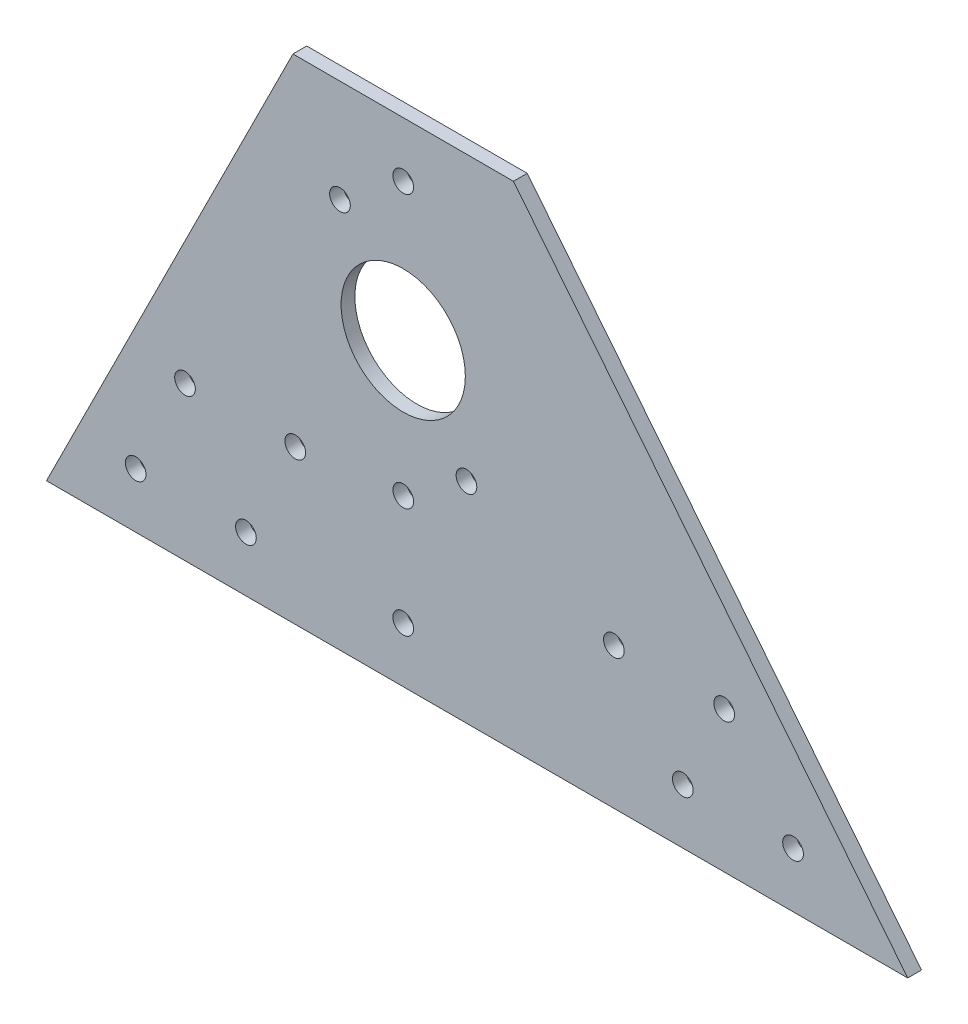
ISO-10303-21;
HEADER;
FILE_DESCRIPTION(('STEP AP214'),'2;1');
FILE_NAME('part.step','',(''),(''),'','','');
FILE_SCHEMA(('AUTOMOTIVE_DESIGN { 1 0 10303 214 1 1 1 1 }'));
ENDSEC;
DATA;
#1=APPLICATION_CONTEXT('core data for automotive mechanical design processes');
#2=APPLICATION_PROTOCOL_DEFINITION('international standard','automotive_design',2000,#1);
#3=PRODUCT_CONTEXT('',#1,'mechanical');
#4=PRODUCT('Part','Part','',(#3));
#5=PRODUCT_RELATED_PRODUCT_CATEGORY('part','',(#4));
#6=PRODUCT_DEFINITION_FORMATION('','',#4);
#7=PRODUCT_DEFINITION_CONTEXT('part definition',#1,'design');
#8=PRODUCT_DEFINITION('design','',#6,#7);
#9=PRODUCT_DEFINITION_SHAPE('','',#8);
#10=(LENGTH_UNIT() NAMED_UNIT(*) SI_UNIT(.MILLI.,.METRE.));
#11=(NAMED_UNIT(*) PLANE_ANGLE_UNIT() SI_UNIT($,.RADIAN.));
#12=(NAMED_UNIT(*) SI_UNIT($,.STERADIAN.) SOLID_ANGLE_UNIT());
#13=UNCERTAINTY_MEASURE_WITH_UNIT(LENGTH_MEASURE(1.E-05),#10,'distance_accuracy_value','');
#14=(GEOMETRIC_REPRESENTATION_CONTEXT(3) GLOBAL_UNCERTAINTY_ASSIGNED_CONTEXT((#13)) GLOBAL_UNIT_ASSIGNED_CONTEXT((#10,
#11,#12)) REPRESENTATION_CONTEXT('',''));
#15=CARTESIAN_POINT('',(0.,0.,0.));
#16=DIRECTION('',(0.,0.,1.));
#17=DIRECTION('',(1.,0.,0.));
#18=AXIS2_PLACEMENT_3D('',#15,#16,#17);
#19=CARTESIAN_POINT('',(-43.0287864369195,21.5190390894908,3.175));
#20=DIRECTION('',(0.894388560370083,-0.447290848418711,0.));
#21=DIRECTION('',(0.447290848418711,0.894388560370083,0.));
#22=AXIS2_PLACEMENT_3D('',#19,#20,#21);
#23=PLANE('',#22);
#24=DIRECTION('',(-0.447290848418711,-0.894388560370083,0.));
#25=VECTOR('',#24,1.);
#26=CARTESIAN_POINT('',(-43.0287864369195,21.5190390894908,0.));
#27=LINE('',#26,#25);
#28=CARTESIAN_POINT('',(-25.4,56.769,0.));
#29=VERTEX_POINT('',#28);
#30=CARTESIAN_POINT('',(-82.1812588376017,-56.769,0.));
#31=VERTEX_POINT('',#30);
#32=EDGE_CURVE('E106',#29,#31,#27,.T.);
#33=ORIENTED_EDGE('',*,*,#32,.T.);
#34=DIRECTION('',(0.,0.,-1.));
#35=VECTOR('',#34,1.);
#36=CARTESIAN_POINT('',(-82.1812588376017,-56.769,3.175));
#37=LINE('',#36,#35);
#38=CARTESIAN_POINT('',(-82.1812588376017,-56.769,3.175));
#39=VERTEX_POINT('',#38);
#40=EDGE_CURVE('E11',#39,#31,#37,.T.);
#41=ORIENTED_EDGE('',*,*,#40,.F.);
#42=DIRECTION('',(-0.447290848418711,-0.894388560370083,0.));
#43=VECTOR('',#42,1.);
#44=CARTESIAN_POINT('',(-43.0287864369195,21.5190390894908,3.175));
#45=LINE('',#44,#43);
#46=CARTESIAN_POINT('',(-25.4,56.769,3.175));
#47=VERTEX_POINT('',#46);
#48=EDGE_CURVE('E89',#47,#39,#45,.T.);
#49=ORIENTED_EDGE('',*,*,#48,.F.);
#50=DIRECTION('',(0.,0.,-1.));
#51=VECTOR('',#50,1.);
#52=CARTESIAN_POINT('',(-25.4,56.769,3.175));
#53=LINE('',#52,#51);
#54=EDGE_CURVE('E55',#47,#29,#53,.T.);
#55=ORIENTED_EDGE('',*,*,#54,.T.);
#56=EDGE_LOOP('',(#33,#41,#49,#55));
#57=FACE_BOUND('',#56,.T.);
#58=ADVANCED_FACE('F39',(#57),#23,.F.);
#59=CARTESIAN_POINT('',(0.,-56.769,3.175));
#60=DIRECTION('',(0.,1.,0.));
#61=DIRECTION('',(-1.,0.,0.));
#62=AXIS2_PLACEMENT_3D('',#59,#60,#61);
#63=PLANE('',#62);
#64=DIRECTION('',(1.,0.,0.));
#65=VECTOR('',#64,1.);
#66=CARTESIAN_POINT('',(0.,-56.769,0.));
#67=LINE('',#66,#65);
#68=CARTESIAN_POINT('',(116.231023145879,-56.769,0.));
#69=VERTEX_POINT('',#68);
#70=EDGE_CURVE('E94',#31,#69,#67,.T.);
#71=ORIENTED_EDGE('',*,*,#70,.T.);
#72=DIRECTION('',(0.,0.,-1.));
#73=VECTOR('',#72,1.);
#74=CARTESIAN_POINT('',(116.231023145879,-56.769,3.175));
#75=LINE('',#74,#73);
#76=CARTESIAN_POINT('',(116.231023145879,-56.769,3.175));
#77=VERTEX_POINT('',#76);
#78=EDGE_CURVE('E47',#77,#69,#75,.T.);
#79=ORIENTED_EDGE('',*,*,#78,.F.);
#80=DIRECTION('',(1.,0.,0.));
#81=VECTOR('',#80,1.);
#82=CARTESIAN_POINT('',(0.,-56.769,3.175));
#83=LINE('',#82,#81);
#84=EDGE_CURVE('E80',#39,#77,#83,.T.);
#85=ORIENTED_EDGE('',*,*,#84,.F.);
#86=ORIENTED_EDGE('',*,*,#40,.T.);
#87=EDGE_LOOP('',(#71,#79,#85,#86));
#88=FACE_BOUND('',#87,.T.);
#89=ADVANCED_FACE('F93',(#88),#63,.F.);
#90=CARTESIAN_POINT('',(43.1799587725832,34.544204008443,3.175));
#91=DIRECTION('',(0.7808667188358,0.624697660804498,0.));
#92=DIRECTION('',(-0.624697660804498,0.7808667188358,0.));
#93=AXIS2_PLACEMENT_3D('',#90,#91,#92);
#94=PLANE('',#93);
#95=DIRECTION('',(0.624697660804498,-0.7808667188358,0.));
#96=VECTOR('',#95,1.);
#97=CARTESIAN_POINT('',(43.1799587725832,34.544204008443,0.));
#98=LINE('',#97,#96);
#99=CARTESIAN_POINT('',(25.4,56.769,0.));
#100=VERTEX_POINT('',#99);
#101=EDGE_CURVE('E110',#100,#69,#98,.T.);
#102=ORIENTED_EDGE('',*,*,#101,.F.);
#103=DIRECTION('',(0.,0.,-1.));
#104=VECTOR('',#103,1.);
#105=CARTESIAN_POINT('',(25.4,56.769,3.175));
#106=LINE('',#105,#104);
#107=CARTESIAN_POINT('',(25.4,56.769,3.175));
#108=VERTEX_POINT('',#107);
#109=EDGE_CURVE('E69',#108,#100,#106,.T.);
#110=ORIENTED_EDGE('',*,*,#109,.F.);
#111=DIRECTION('',(0.624697660804498,-0.7808667188358,0.));
#112=VECTOR('',#111,1.);
#113=CARTESIAN_POINT('',(43.1799587725832,34.544204008443,3.175));
#114=LINE('',#113,#112);
#115=EDGE_CURVE('E88',#108,#77,#114,.T.);
#116=ORIENTED_EDGE('',*,*,#115,.T.);
#117=ORIENTED_EDGE('',*,*,#78,.T.);
#118=EDGE_LOOP('',(#102,#110,#116,#117));
#119=FACE_BOUND('',#118,.T.);
#120=ADVANCED_FACE('F97',(#119),#94,.T.);
#121=CARTESIAN_POINT('',(0.,56.769,3.175));
#122=DIRECTION('',(0.,1.,0.));
#123=DIRECTION('',(0.,0.,1.));
#124=AXIS2_PLACEMENT_3D('',#121,#122,#123);
#125=PLANE('',#124);
#126=DIRECTION('',(1.,0.,0.));
#127=VECTOR('',#126,1.);
#128=CARTESIAN_POINT('',(0.,56.769,0.));
#129=LINE('',#128,#127);
#130=EDGE_CURVE('E112',#29,#100,#129,.T.);
#131=ORIENTED_EDGE('',*,*,#130,.F.);
#132=ORIENTED_EDGE('',*,*,#54,.F.);
#133=DIRECTION('',(1.,0.,0.));
#134=VECTOR('',#133,1.);
#135=CARTESIAN_POINT('',(0.,56.769,3.175));
#136=LINE('',#135,#134);
#137=EDGE_CURVE('E98',#47,#108,#136,.T.);
#138=ORIENTED_EDGE('',*,*,#137,.T.);
#139=ORIENTED_EDGE('',*,*,#109,.T.);
#140=EDGE_LOOP('',(#131,#132,#138,#139));
#141=FACE_BOUND('',#140,.T.);
#142=ADVANCED_FACE('F258',(#141),#125,.T.);
#143=CARTESIAN_POINT('',(0.,12.319,3.175));
#144=DIRECTION('',(0.,0.,-1.));
#145=DIRECTION('',(-1.,0.,0.));
#146=AXIS2_PLACEMENT_3D('',#143,#144,#145);
#147=CYLINDRICAL_SURFACE('',#146,14.3129);
#148=CARTESIAN_POINT('',(0.,12.319,3.175));
#149=DIRECTION('',(0.,0.,1.));
#150=DIRECTION('',(1.,0.,0.));
#151=AXIS2_PLACEMENT_3D('',#148,#149,#150);
#152=CIRCLE('',#151,14.3129);
#153=CARTESIAN_POINT('',(14.3129,12.319,3.175));
#154=VERTEX_POINT('',#153);
#155=EDGE_CURVE('E100',#154,#154,#152,.T.);
#156=ORIENTED_EDGE('',*,*,#155,.T.);
#157=EDGE_LOOP('',(#156));
#158=FACE_BOUND('',#157,.T.);
#159=CARTESIAN_POINT('',(0.,12.319,0.));
#160=DIRECTION('',(0.,0.,1.));
#161=DIRECTION('',(1.,0.,0.));
#162=AXIS2_PLACEMENT_3D('',#159,#160,#161);
#163=CIRCLE('',#162,14.3129);
#164=CARTESIAN_POINT('',(14.3129,12.319,0.));
#165=VERTEX_POINT('',#164);
#166=EDGE_CURVE('E115',#165,#165,#163,.T.);
#167=ORIENTED_EDGE('',*,*,#166,.F.);
#168=EDGE_LOOP('',(#167));
#169=FACE_BOUND('',#168,.T.);
#170=ADVANCED_FACE('F212',(#158,#169),#147,.F.);
#171=CARTESIAN_POINT('',(0.,0.,3.175));
#172=DIRECTION('',(0.,0.,1.));
#173=DIRECTION('',(1.,0.,0.));
#174=AXIS2_PLACEMENT_3D('',#171,#172,#173);
#175=PLANE('',#174);
#176=CARTESIAN_POINT('',(-14.5688414833166,33.1254619249403,3.175));
#177=DIRECTION('',(0.,0.,1.));
#178=DIRECTION('',(1.,0.,0.));
#179=AXIS2_PLACEMENT_3D('',#176,#177,#178);
#180=CIRCLE('',#179,2.38125);
#181=CARTESIAN_POINT('',(-12.1875914833166,33.1254619249403,3.175));
#182=VERTEX_POINT('',#181);
#183=EDGE_CURVE('E194',#182,#182,#180,.T.);
#184=ORIENTED_EDGE('',*,*,#183,.F.);
#185=EDGE_LOOP('',(#184));
#186=FACE_BOUND('',#185,.T.);
#187=CARTESIAN_POINT('',(14.5688414833166,-8.48746192494038,3.175));
#188=DIRECTION('',(0.,0.,1.));
#189=DIRECTION('',(1.,0.,0.));
#190=AXIS2_PLACEMENT_3D('',#187,#188,#189);
#191=CIRCLE('',#190,2.38125);
#192=CARTESIAN_POINT('',(16.9500914833166,-8.48746192494038,3.175));
#193=VERTEX_POINT('',#192);
#194=EDGE_CURVE('E191',#193,#193,#191,.T.);
#195=ORIENTED_EDGE('',*,*,#194,.F.);
#196=EDGE_LOOP('',(#195));
#197=FACE_BOUND('',#196,.T.);
#198=CARTESIAN_POINT('',(0.,44.069,3.175));
#199=DIRECTION('',(0.,0.,1.));
#200=DIRECTION('',(1.,0.,0.));
#201=AXIS2_PLACEMENT_3D('',#198,#199,#200);
#202=CIRCLE('',#201,2.38125);
#203=CARTESIAN_POINT('',(2.38125,44.069,3.175));
#204=VERTEX_POINT('',#203);
#205=EDGE_CURVE('E183',#204,#204,#202,.T.);
#206=ORIENTED_EDGE('',*,*,#205,.F.);
#207=EDGE_LOOP('',(#206));
#208=FACE_BOUND('',#207,.T.);
#209=CARTESIAN_POINT('',(0.,-18.669,3.175));
#210=DIRECTION('',(0.,0.,1.));
#211=DIRECTION('',(1.,0.,0.));
#212=AXIS2_PLACEMENT_3D('',#209,#210,#211);
#213=CIRCLE('',#212,2.38125);
#214=CARTESIAN_POINT('',(2.38125,-18.669,3.175));
#215=VERTEX_POINT('',#214);
#216=EDGE_CURVE('E180',#215,#215,#213,.T.);
#217=ORIENTED_EDGE('',*,*,#216,.F.);
#218=EDGE_LOOP('',(#217));
#219=FACE_BOUND('',#218,.T.);
#220=CARTESIAN_POINT('',(0.,-44.069,3.175));
#221=DIRECTION('',(0.,0.,1.));
#222=DIRECTION('',(1.,0.,0.));
#223=AXIS2_PLACEMENT_3D('',#220,#221,#222);
#224=CIRCLE('',#223,2.38125);
#225=CARTESIAN_POINT('',(2.38125,-44.069,3.175));
#226=VERTEX_POINT('',#225);
#227=EDGE_CURVE('E173',#226,#226,#224,.T.);
#228=ORIENTED_EDGE('',*,*,#227,.F.);
#229=EDGE_LOOP('',(#228));
#230=FACE_BOUND('',#229,.T.);
#231=CARTESIAN_POINT('',(-61.6302426581102,-44.069,3.175));
#232=DIRECTION('',(0.,0.,1.));
#233=DIRECTION('',(1.,0.,0.));
#234=AXIS2_PLACEMENT_3D('',#231,#232,#233);
#235=CIRCLE('',#234,2.38125);
#236=CARTESIAN_POINT('',(-59.2489926581102,-44.069,3.175));
#237=VERTEX_POINT('',#236);
#238=EDGE_CURVE('E147',#237,#237,#235,.T.);
#239=ORIENTED_EDGE('',*,*,#238,.F.);
#240=EDGE_LOOP('',(#239));
#241=FACE_BOUND('',#240,.T.);
#242=CARTESIAN_POINT('',(89.8069743363971,-44.069,3.175));
#243=DIRECTION('',(0.,0.,1.));
#244=DIRECTION('',(1.,0.,0.));
#245=AXIS2_PLACEMENT_3D('',#242,#243,#244);
#246=CIRCLE('',#245,2.38125);
#247=CARTESIAN_POINT('',(92.1882243363971,-44.069,3.175));
#248=VERTEX_POINT('',#247);
#249=EDGE_CURVE('E126',#248,#248,#246,.T.);
#250=ORIENTED_EDGE('',*,*,#249,.F.);
#251=EDGE_LOOP('',(#250));
#252=FACE_BOUND('',#251,.T.);
#253=CARTESIAN_POINT('',(48.5396537519629,-24.2349853415707,3.175));
#254=DIRECTION('',(0.,0.,1.));
#255=DIRECTION('',(1.,0.,0.));
#256=AXIS2_PLACEMENT_3D('',#253,#254,#255);
#257=CIRCLE('',#256,2.38125);
#258=CARTESIAN_POINT('',(50.9209037519629,-24.2349853415707,3.175));
#259=VERTEX_POINT('',#258);
#260=EDGE_CURVE('E151',#259,#259,#257,.T.);
#261=ORIENTED_EDGE('',*,*,#260,.F.);
#262=EDGE_LOOP('',(#261));
#263=FACE_BOUND('',#262,.T.);
#264=CARTESIAN_POINT('',(73.9396537519629,-24.2349853415707,3.175));
#265=DIRECTION('',(0.,0.,1.));
#266=DIRECTION('',(1.,0.,0.));
#267=AXIS2_PLACEMENT_3D('',#264,#265,#266);
#268=CIRCLE('',#267,2.38125);
#269=CARTESIAN_POINT('',(76.3209037519629,-24.2349853415707,3.175));
#270=VERTEX_POINT('',#269);
#271=EDGE_CURVE('E152',#270,#270,#268,.T.);
#272=ORIENTED_EDGE('',*,*,#271,.F.);
#273=EDGE_LOOP('',(#272));
#274=FACE_BOUND('',#273,.T.);
#275=CARTESIAN_POINT('',(-24.869055108275,-21.3515305665999,3.175));
#276=DIRECTION('',(0.,0.,1.));
#277=DIRECTION('',(1.,0.,0.));
#278=AXIS2_PLACEMENT_3D('',#275,#276,#277);
#279=CIRCLE('',#278,2.38125);
#280=CARTESIAN_POINT('',(-22.487805108275,-21.3515305665999,3.175));
#281=VERTEX_POINT('',#280);
#282=EDGE_CURVE('E125',#281,#281,#279,.T.);
#283=ORIENTED_EDGE('',*,*,#282,.F.);
#284=EDGE_LOOP('',(#283));
#285=FACE_BOUND('',#284,.T.);
#286=CARTESIAN_POINT('',(-50.269055108275,-21.3515305665999,3.175));
#287=DIRECTION('',(0.,0.,1.));
#288=DIRECTION('',(1.,0.,0.));
#289=AXIS2_PLACEMENT_3D('',#286,#287,#288);
#290=CIRCLE('',#289,2.38125);
#291=CARTESIAN_POINT('',(-47.887805108275,-21.3515305665999,3.175));
#292=VERTEX_POINT('',#291);
#293=EDGE_CURVE('E132',#292,#292,#290,.T.);
#294=ORIENTED_EDGE('',*,*,#293,.F.);
#295=EDGE_LOOP('',(#294));
#296=FACE_BOUND('',#295,.T.);
#297=CARTESIAN_POINT('',(64.4069743363971,-44.069,3.175));
#298=DIRECTION('',(0.,0.,1.));
#299=DIRECTION('',(1.,0.,0.));
#300=AXIS2_PLACEMENT_3D('',#297,#298,#299);
#301=CIRCLE('',#300,2.38125);
#302=CARTESIAN_POINT('',(66.7882243363971,-44.069,3.175));
#303=VERTEX_POINT('',#302);
#304=EDGE_CURVE('E138',#303,#303,#301,.T.);
#305=ORIENTED_EDGE('',*,*,#304,.F.);
#306=EDGE_LOOP('',(#305));
#307=FACE_BOUND('',#306,.T.);
#308=CARTESIAN_POINT('',(-36.2302426581102,-44.069,3.175));
#309=DIRECTION('',(0.,0.,1.));
#310=DIRECTION('',(1.,0.,0.));
#311=AXIS2_PLACEMENT_3D('',#308,#309,#310);
#312=CIRCLE('',#311,2.38125);
#313=CARTESIAN_POINT('',(-33.8489926581102,-44.069,3.175));
#314=VERTEX_POINT('',#313);
#315=EDGE_CURVE('E144',#314,#314,#312,.T.);
#316=ORIENTED_EDGE('',*,*,#315,.F.);
#317=EDGE_LOOP('',(#316));
#318=FACE_BOUND('',#317,.T.);
#319=ORIENTED_EDGE('',*,*,#48,.T.);
#320=ORIENTED_EDGE('',*,*,#84,.T.);
#321=ORIENTED_EDGE('',*,*,#115,.F.);
#322=ORIENTED_EDGE('',*,*,#137,.F.);
#323=EDGE_LOOP('',(#319,#320,#321,#322));
#324=FACE_BOUND('',#323,.T.);
#325=ORIENTED_EDGE('',*,*,#155,.F.);
#326=EDGE_LOOP('',(#325));
#327=FACE_BOUND('',#326,.T.);
#328=ADVANCED_FACE('F84',(#186,#197,#208,#219,#230,#241,#252,#263,#274,#285,#296,#307,#318,#324,
#327),#175,.T.);
#329=CARTESIAN_POINT('',(0.,0.,0.));
#330=DIRECTION('',(0.,0.,1.));
#331=DIRECTION('',(1.,0.,0.));
#332=AXIS2_PLACEMENT_3D('',#329,#330,#331);
#333=PLANE('',#332);
#334=CARTESIAN_POINT('',(-14.5688414833166,33.1254619249403,0.));
#335=DIRECTION('',(0.,0.,1.));
#336=DIRECTION('',(1.,0.,0.));
#337=AXIS2_PLACEMENT_3D('',#334,#335,#336);
#338=CIRCLE('',#337,2.38125);
#339=CARTESIAN_POINT('',(-12.1875914833166,33.1254619249403,0.));
#340=VERTEX_POINT('',#339);
#341=EDGE_CURVE('E174',#340,#340,#338,.T.);
#342=ORIENTED_EDGE('',*,*,#341,.T.);
#343=EDGE_LOOP('',(#342));
#344=FACE_BOUND('',#343,.T.);
#345=CARTESIAN_POINT('',(14.5688414833166,-8.48746192494038,0.));
#346=DIRECTION('',(0.,0.,1.));
#347=DIRECTION('',(1.,0.,0.));
#348=AXIS2_PLACEMENT_3D('',#345,#346,#347);
#349=CIRCLE('',#348,2.38125);
#350=CARTESIAN_POINT('',(16.9500914833166,-8.48746192494038,0.));
#351=VERTEX_POINT('',#350);
#352=EDGE_CURVE('E188',#351,#351,#349,.T.);
#353=ORIENTED_EDGE('',*,*,#352,.T.);
#354=EDGE_LOOP('',(#353));
#355=FACE_BOUND('',#354,.T.);
#356=CARTESIAN_POINT('',(0.,44.069,0.));
#357=DIRECTION('',(0.,0.,1.));
#358=DIRECTION('',(1.,0.,0.));
#359=AXIS2_PLACEMENT_3D('',#356,#357,#358);
#360=CIRCLE('',#359,2.38125);
#361=CARTESIAN_POINT('',(2.38125,44.069,0.));
#362=VERTEX_POINT('',#361);
#363=EDGE_CURVE('E163',#362,#362,#360,.T.);
#364=ORIENTED_EDGE('',*,*,#363,.T.);
#365=EDGE_LOOP('',(#364));
#366=FACE_BOUND('',#365,.T.);
#367=CARTESIAN_POINT('',(0.,-18.669,0.));
#368=DIRECTION('',(0.,0.,1.));
#369=DIRECTION('',(1.,0.,0.));
#370=AXIS2_PLACEMENT_3D('',#367,#368,#369);
#371=CIRCLE('',#370,2.38125);
#372=CARTESIAN_POINT('',(2.38125,-18.669,0.));
#373=VERTEX_POINT('',#372);
#374=EDGE_CURVE('E177',#373,#373,#371,.T.);
#375=ORIENTED_EDGE('',*,*,#374,.T.);
#376=EDGE_LOOP('',(#375));
#377=FACE_BOUND('',#376,.T.);
#378=CARTESIAN_POINT('',(0.,-44.069,0.));
#379=DIRECTION('',(0.,0.,1.));
#380=DIRECTION('',(1.,0.,0.));
#381=AXIS2_PLACEMENT_3D('',#378,#379,#380);
#382=CIRCLE('',#381,2.38125);
#383=CARTESIAN_POINT('',(2.38125,-44.069,0.));
#384=VERTEX_POINT('',#383);
#385=EDGE_CURVE('E170',#384,#384,#382,.T.);
#386=ORIENTED_EDGE('',*,*,#385,.T.);
#387=EDGE_LOOP('',(#386));
#388=FACE_BOUND('',#387,.T.);
#389=CARTESIAN_POINT('',(-61.6302426581102,-44.069,0.));
#390=DIRECTION('',(0.,0.,1.));
#391=DIRECTION('',(1.,0.,0.));
#392=AXIS2_PLACEMENT_3D('',#389,#390,#391);
#393=CIRCLE('',#392,2.38125);
#394=CARTESIAN_POINT('',(-59.2489926581102,-44.069,0.));
#395=VERTEX_POINT('',#394);
#396=EDGE_CURVE('E108',#395,#395,#393,.T.);
#397=ORIENTED_EDGE('',*,*,#396,.T.);
#398=EDGE_LOOP('',(#397));
#399=FACE_BOUND('',#398,.T.);
#400=CARTESIAN_POINT('',(89.8069743363971,-44.069,0.));
#401=DIRECTION('',(0.,0.,1.));
#402=DIRECTION('',(1.,0.,0.));
#403=AXIS2_PLACEMENT_3D('',#400,#401,#402);
#404=CIRCLE('',#403,2.38125);
#405=CARTESIAN_POINT('',(92.1882243363971,-44.069,0.));
#406=VERTEX_POINT('',#405);
#407=EDGE_CURVE('E155',#406,#406,#404,.T.);
#408=ORIENTED_EDGE('',*,*,#407,.T.);
#409=EDGE_LOOP('',(#408));
#410=FACE_BOUND('',#409,.T.);
#411=CARTESIAN_POINT('',(48.5396537519629,-24.2349853415707,0.));
#412=DIRECTION('',(0.,0.,1.));
#413=DIRECTION('',(1.,0.,0.));
#414=AXIS2_PLACEMENT_3D('',#411,#412,#413);
#415=CIRCLE('',#414,2.38125);
#416=CARTESIAN_POINT('',(50.9209037519629,-24.2349853415707,0.));
#417=VERTEX_POINT('',#416);
#418=EDGE_CURVE('E148',#417,#417,#415,.T.);
#419=ORIENTED_EDGE('',*,*,#418,.T.);
#420=EDGE_LOOP('',(#419));
#421=FACE_BOUND('',#420,.T.);
#422=CARTESIAN_POINT('',(73.9396537519629,-24.2349853415707,0.));
#423=DIRECTION('',(0.,0.,1.));
#424=DIRECTION('',(1.,0.,0.));
#425=AXIS2_PLACEMENT_3D('',#422,#423,#424);
#426=CIRCLE('',#425,2.38125);
#427=CARTESIAN_POINT('',(76.3209037519629,-24.2349853415707,0.));
#428=VERTEX_POINT('',#427);
#429=EDGE_CURVE('E160',#428,#428,#426,.T.);
#430=ORIENTED_EDGE('',*,*,#429,.T.);
#431=EDGE_LOOP('',(#430));
#432=FACE_BOUND('',#431,.T.);
#433=CARTESIAN_POINT('',(-24.869055108275,-21.3515305665999,0.));
#434=DIRECTION('',(0.,0.,1.));
#435=DIRECTION('',(1.,0.,0.));
#436=AXIS2_PLACEMENT_3D('',#433,#434,#435);
#437=CIRCLE('',#436,2.38125);
#438=CARTESIAN_POINT('',(-22.487805108275,-21.3515305665999,0.));
#439=VERTEX_POINT('',#438);
#440=EDGE_CURVE('E122',#439,#439,#437,.T.);
#441=ORIENTED_EDGE('',*,*,#440,.T.);
#442=EDGE_LOOP('',(#441));
#443=FACE_BOUND('',#442,.T.);
#444=CARTESIAN_POINT('',(-50.269055108275,-21.3515305665999,0.));
#445=DIRECTION('',(0.,0.,1.));
#446=DIRECTION('',(1.,0.,0.));
#447=AXIS2_PLACEMENT_3D('',#444,#445,#446);
#448=CIRCLE('',#447,2.38125);
#449=CARTESIAN_POINT('',(-47.887805108275,-21.3515305665999,0.));
#450=VERTEX_POINT('',#449);
#451=EDGE_CURVE('E129',#450,#450,#448,.T.);
#452=ORIENTED_EDGE('',*,*,#451,.T.);
#453=EDGE_LOOP('',(#452));
#454=FACE_BOUND('',#453,.T.);
#455=CARTESIAN_POINT('',(64.4069743363971,-44.069,0.));
#456=DIRECTION('',(0.,0.,1.));
#457=DIRECTION('',(1.,0.,0.));
#458=AXIS2_PLACEMENT_3D('',#455,#456,#457);
#459=CIRCLE('',#458,2.38125);
#460=CARTESIAN_POINT('',(66.7882243363971,-44.069,0.));
#461=VERTEX_POINT('',#460);
#462=EDGE_CURVE('E135',#461,#461,#459,.T.);
#463=ORIENTED_EDGE('',*,*,#462,.T.);
#464=EDGE_LOOP('',(#463));
#465=FACE_BOUND('',#464,.T.);
#466=CARTESIAN_POINT('',(-36.2302426581102,-44.069,0.));
#467=DIRECTION('',(0.,0.,1.));
#468=DIRECTION('',(1.,0.,0.));
#469=AXIS2_PLACEMENT_3D('',#466,#467,#468);
#470=CIRCLE('',#469,2.38125);
#471=CARTESIAN_POINT('',(-33.8489926581102,-44.069,0.));
#472=VERTEX_POINT('',#471);
#473=EDGE_CURVE('E141',#472,#472,#470,.T.);
#474=ORIENTED_EDGE('',*,*,#473,.T.);
#475=EDGE_LOOP('',(#474));
#476=FACE_BOUND('',#475,.T.);
#477=ORIENTED_EDGE('',*,*,#32,.F.);
#478=ORIENTED_EDGE('',*,*,#130,.T.);
#479=ORIENTED_EDGE('',*,*,#101,.T.);
#480=ORIENTED_EDGE('',*,*,#70,.F.);
#481=EDGE_LOOP('',(#477,#478,#479,#480));
#482=FACE_BOUND('',#481,.T.);
#483=ORIENTED_EDGE('',*,*,#166,.T.);
#484=EDGE_LOOP('',(#483));
#485=FACE_BOUND('',#484,.T.);
#486=ADVANCED_FACE('F200',(#344,#355,#366,#377,#388,#399,#410,#421,#432,#443,#454,#465,#476,
#482,#485),#333,.F.);
#487=CARTESIAN_POINT('',(-36.2302426581102,-44.069,0.));
#488=DIRECTION('',(0.,0.,1.));
#489=DIRECTION('',(1.,0.,0.));
#490=AXIS2_PLACEMENT_3D('',#487,#488,#489);
#491=CYLINDRICAL_SURFACE('',#490,2.38125);
#492=ORIENTED_EDGE('',*,*,#473,.F.);
#493=EDGE_LOOP('',(#492));
#494=FACE_BOUND('',#493,.T.);
#495=ORIENTED_EDGE('',*,*,#315,.T.);
#496=EDGE_LOOP('',(#495));
#497=FACE_BOUND('',#496,.T.);
#498=ADVANCED_FACE('F238',(#494,#497),#491,.F.);
#499=CARTESIAN_POINT('',(64.4069743363971,-44.069,0.));
#500=DIRECTION('',(0.,0.,1.));
#501=DIRECTION('',(1.,0.,0.));
#502=AXIS2_PLACEMENT_3D('',#499,#500,#501);
#503=CYLINDRICAL_SURFACE('',#502,2.38125);
#504=ORIENTED_EDGE('',*,*,#462,.F.);
#505=EDGE_LOOP('',(#504));
#506=FACE_BOUND('',#505,.T.);
#507=ORIENTED_EDGE('',*,*,#304,.T.);
#508=EDGE_LOOP('',(#507));
#509=FACE_BOUND('',#508,.T.);
#510=ADVANCED_FACE('F240',(#506,#509),#503,.F.);
#511=CARTESIAN_POINT('',(-50.269055108275,-21.3515305665999,0.));
#512=DIRECTION('',(0.,0.,1.));
#513=DIRECTION('',(1.,0.,0.));
#514=AXIS2_PLACEMENT_3D('',#511,#512,#513);
#515=CYLINDRICAL_SURFACE('',#514,2.38125);
#516=ORIENTED_EDGE('',*,*,#451,.F.);
#517=EDGE_LOOP('',(#516));
#518=FACE_BOUND('',#517,.T.);
#519=ORIENTED_EDGE('',*,*,#293,.T.);
#520=EDGE_LOOP('',(#519));
#521=FACE_BOUND('',#520,.T.);
#522=ADVANCED_FACE('F247',(#518,#521),#515,.F.);
#523=CARTESIAN_POINT('',(-24.869055108275,-21.3515305665999,0.));
#524=DIRECTION('',(0.,0.,1.));
#525=DIRECTION('',(1.,0.,0.));
#526=AXIS2_PLACEMENT_3D('',#523,#524,#525);
#527=CYLINDRICAL_SURFACE('',#526,2.38125);
#528=ORIENTED_EDGE('',*,*,#440,.F.);
#529=EDGE_LOOP('',(#528));
#530=FACE_BOUND('',#529,.T.);
#531=ORIENTED_EDGE('',*,*,#282,.T.);
#532=EDGE_LOOP('',(#531));
#533=FACE_BOUND('',#532,.T.);
#534=ADVANCED_FACE('F269',(#530,#533),#527,.F.);
#535=CARTESIAN_POINT('',(73.9396537519629,-24.2349853415707,0.));
#536=DIRECTION('',(0.,0.,1.));
#537=DIRECTION('',(1.,0.,0.));
#538=AXIS2_PLACEMENT_3D('',#535,#536,#537);
#539=CYLINDRICAL_SURFACE('',#538,2.38125);
#540=ORIENTED_EDGE('',*,*,#429,.F.);
#541=EDGE_LOOP('',(#540));
#542=FACE_BOUND('',#541,.T.);
#543=ORIENTED_EDGE('',*,*,#271,.T.);
#544=EDGE_LOOP('',(#543));
#545=FACE_BOUND('',#544,.T.);
#546=ADVANCED_FACE('F272',(#542,#545),#539,.F.);
#547=CARTESIAN_POINT('',(48.5396537519629,-24.2349853415707,0.));
#548=DIRECTION('',(0.,0.,1.));
#549=DIRECTION('',(1.,0.,0.));
#550=AXIS2_PLACEMENT_3D('',#547,#548,#549);
#551=CYLINDRICAL_SURFACE('',#550,2.38125);
#552=ORIENTED_EDGE('',*,*,#418,.F.);
#553=EDGE_LOOP('',(#552));
#554=FACE_BOUND('',#553,.T.);
#555=ORIENTED_EDGE('',*,*,#260,.T.);
#556=EDGE_LOOP('',(#555));
#557=FACE_BOUND('',#556,.T.);
#558=ADVANCED_FACE('F297',(#554,#557),#551,.F.);
#559=CARTESIAN_POINT('',(89.8069743363971,-44.069,0.));
#560=DIRECTION('',(0.,0.,1.));
#561=DIRECTION('',(1.,0.,0.));
#562=AXIS2_PLACEMENT_3D('',#559,#560,#561);
#563=CYLINDRICAL_SURFACE('',#562,2.38125);
#564=ORIENTED_EDGE('',*,*,#407,.F.);
#565=EDGE_LOOP('',(#564));
#566=FACE_BOUND('',#565,.T.);
#567=ORIENTED_EDGE('',*,*,#249,.T.);
#568=EDGE_LOOP('',(#567));
#569=FACE_BOUND('',#568,.T.);
#570=ADVANCED_FACE('F305',(#566,#569),#563,.F.);
#571=CARTESIAN_POINT('',(-61.6302426581102,-44.069,0.));
#572=DIRECTION('',(0.,0.,1.));
#573=DIRECTION('',(1.,0.,0.));
#574=AXIS2_PLACEMENT_3D('',#571,#572,#573);
#575=CYLINDRICAL_SURFACE('',#574,2.38125);
#576=ORIENTED_EDGE('',*,*,#396,.F.);
#577=EDGE_LOOP('',(#576));
#578=FACE_BOUND('',#577,.T.);
#579=ORIENTED_EDGE('',*,*,#238,.T.);
#580=EDGE_LOOP('',(#579));
#581=FACE_BOUND('',#580,.T.);
#582=ADVANCED_FACE('F312',(#578,#581),#575,.F.);
#583=CARTESIAN_POINT('',(0.,-44.069,0.));
#584=DIRECTION('',(0.,0.,1.));
#585=DIRECTION('',(1.,0.,0.));
#586=AXIS2_PLACEMENT_3D('',#583,#584,#585);
#587=CYLINDRICAL_SURFACE('',#586,2.38125);
#588=ORIENTED_EDGE('',*,*,#385,.F.);
#589=EDGE_LOOP('',(#588));
#590=FACE_BOUND('',#589,.T.);
#591=ORIENTED_EDGE('',*,*,#227,.T.);
#592=EDGE_LOOP('',(#591));
#593=FACE_BOUND('',#592,.T.);
#594=ADVANCED_FACE('F320',(#590,#593),#587,.F.);
#595=CARTESIAN_POINT('',(0.,-18.669,0.));
#596=DIRECTION('',(0.,0.,1.));
#597=DIRECTION('',(1.,0.,0.));
#598=AXIS2_PLACEMENT_3D('',#595,#596,#597);
#599=CYLINDRICAL_SURFACE('',#598,2.38125);
#600=ORIENTED_EDGE('',*,*,#374,.F.);
#601=EDGE_LOOP('',(#600));
#602=FACE_BOUND('',#601,.T.);
#603=ORIENTED_EDGE('',*,*,#216,.T.);
#604=EDGE_LOOP('',(#603));
#605=FACE_BOUND('',#604,.T.);
#606=ADVANCED_FACE('F328',(#602,#605),#599,.F.);
#607=CARTESIAN_POINT('',(0.,44.069,0.));
#608=DIRECTION('',(0.,0.,1.));
#609=DIRECTION('',(1.,0.,0.));
#610=AXIS2_PLACEMENT_3D('',#607,#608,#609);
#611=CYLINDRICAL_SURFACE('',#610,2.38125);
#612=ORIENTED_EDGE('',*,*,#363,.F.);
#613=EDGE_LOOP('',(#612));
#614=FACE_BOUND('',#613,.T.);
#615=ORIENTED_EDGE('',*,*,#205,.T.);
#616=EDGE_LOOP('',(#615));
#617=FACE_BOUND('',#616,.T.);
#618=ADVANCED_FACE('F336',(#614,#617),#611,.F.);
#619=CARTESIAN_POINT('',(14.5688414833166,-8.48746192494038,0.));
#620=DIRECTION('',(0.,0.,1.));
#621=DIRECTION('',(1.,0.,0.));
#622=AXIS2_PLACEMENT_3D('',#619,#620,#621);
#623=CYLINDRICAL_SURFACE('',#622,2.38125);
#624=ORIENTED_EDGE('',*,*,#352,.F.);
#625=EDGE_LOOP('',(#624));
#626=FACE_BOUND('',#625,.T.);
#627=ORIENTED_EDGE('',*,*,#194,.T.);
#628=EDGE_LOOP('',(#627));
#629=FACE_BOUND('',#628,.T.);
#630=ADVANCED_FACE('F206',(#626,#629),#623,.F.);
#631=CARTESIAN_POINT('',(-14.5688414833166,33.1254619249403,0.));
#632=DIRECTION('',(0.,0.,1.));
#633=DIRECTION('',(1.,0.,0.));
#634=AXIS2_PLACEMENT_3D('',#631,#632,#633);
#635=CYLINDRICAL_SURFACE('',#634,2.38125);
#636=ORIENTED_EDGE('',*,*,#341,.F.);
#637=EDGE_LOOP('',(#636));
#638=FACE_BOUND('',#637,.T.);
#639=ORIENTED_EDGE('',*,*,#183,.T.);
#640=EDGE_LOOP('',(#639));
#641=FACE_BOUND('',#640,.T.);
#642=ADVANCED_FACE('F203',(#638,#641),#635,.F.);
#643=CLOSED_SHELL('',(#58,#89,#120,#142,#170,#328,#486,#498,#510,#522,#534,#546,#558,#570,#582,
#594,#606,#618,#630,#642));
#644=MANIFOLD_SOLID_BREP('B2',#643);
#645=ADVANCED_BREP_SHAPE_REPRESENTATION('',(#18,#644),#14);
#646=SHAPE_DEFINITION_REPRESENTATION(#9,#645);
ENDSEC;
END-ISO-10303-21;
